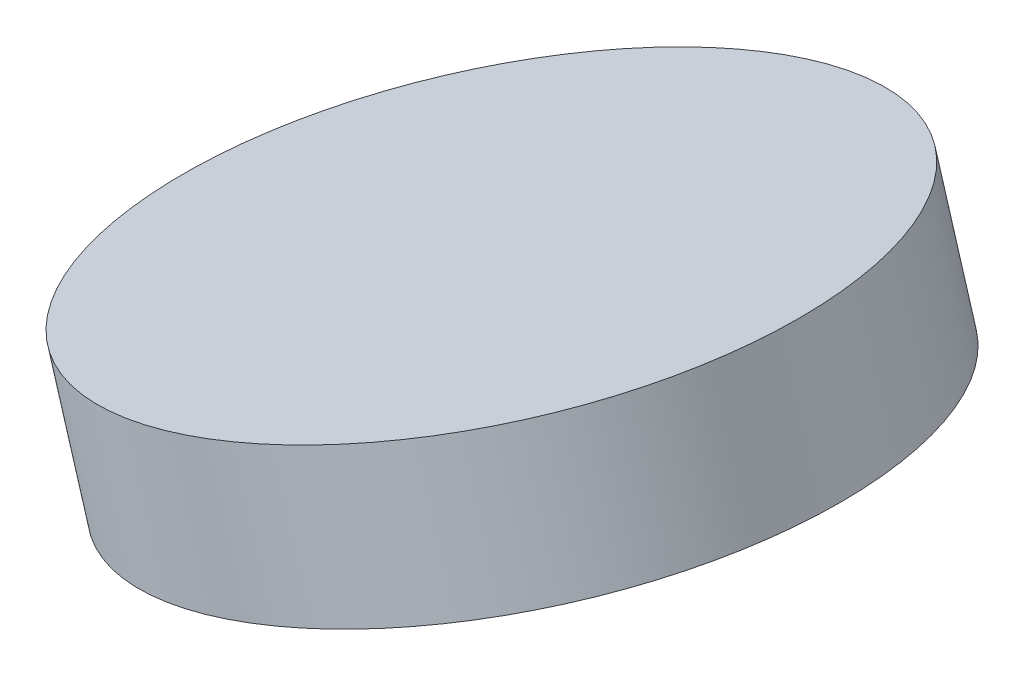
ISO-10303-21;
HEADER;
FILE_DESCRIPTION(('STEP AP214'),'2;1');
FILE_NAME('part.step','',(''),(''),'','','');
FILE_SCHEMA(('AUTOMOTIVE_DESIGN { 1 0 10303 214 1 1 1 1 }'));
ENDSEC;
DATA;
#1=APPLICATION_CONTEXT('core data for automotive mechanical design processes');
#2=APPLICATION_PROTOCOL_DEFINITION('international standard','automotive_design',2000,#1);
#3=PRODUCT_CONTEXT('',#1,'mechanical');
#4=PRODUCT('Part','Part','',(#3));
#5=PRODUCT_RELATED_PRODUCT_CATEGORY('part','',(#4));
#6=PRODUCT_DEFINITION_FORMATION('','',#4);
#7=PRODUCT_DEFINITION_CONTEXT('part definition',#1,'design');
#8=PRODUCT_DEFINITION('design','',#6,#7);
#9=PRODUCT_DEFINITION_SHAPE('','',#8);
#10=(LENGTH_UNIT() NAMED_UNIT(*) SI_UNIT(.MILLI.,.METRE.));
#11=(NAMED_UNIT(*) PLANE_ANGLE_UNIT() SI_UNIT($,.RADIAN.));
#12=(NAMED_UNIT(*) SI_UNIT($,.STERADIAN.) SOLID_ANGLE_UNIT());
#13=UNCERTAINTY_MEASURE_WITH_UNIT(LENGTH_MEASURE(1.E-05),#10,'distance_accuracy_value','');
#14=(GEOMETRIC_REPRESENTATION_CONTEXT(3) GLOBAL_UNCERTAINTY_ASSIGNED_CONTEXT((#13)) GLOBAL_UNIT_ASSIGNED_CONTEXT((#10,
#11,#12)) REPRESENTATION_CONTEXT('',''));
#15=CARTESIAN_POINT('',(0.,0.,0.));
#16=DIRECTION('',(0.,0.,1.));
#17=DIRECTION('',(1.,0.,0.));
#18=AXIS2_PLACEMENT_3D('',#15,#16,#17);
#19=CARTESIAN_POINT('',(-2.85333923385209,9.58428167452148,0.));
#20=DIRECTION('',(-0.285333923385198,0.95842816745211,0.));
#21=DIRECTION('',(-0.95842816745211,-0.285333923385198,0.));
#22=AXIS2_PLACEMENT_3D('',#19,#20,#21);
#23=CYLINDRICAL_SURFACE('',#22,4.44037160607082);
#24=CARTESIAN_POINT('',(-2.85333923385209,9.58428167452148,0.));
#25=DIRECTION('',(0.285333923385198,-0.95842816745211,0.));
#26=DIRECTION('',(0.95842816745211,0.285333923385198,0.));
#27=AXIS2_PLACEMENT_3D('',#24,#25,#26);
#28=CIRCLE('',#27,4.44037160607082);
#29=CARTESIAN_POINT('',(1.40243798736075,10.8512703261699,0.));
#30=VERTEX_POINT('',#29);
#31=EDGE_CURVE('E10',#30,#30,#28,.T.);
#32=ORIENTED_EDGE('',*,*,#31,.F.);
#33=EDGE_LOOP('',(#32));
#34=FACE_BOUND('',#33,.T.);
#35=CARTESIAN_POINT('',(-3.42400708062248,11.5011380094257,0.));
#36=DIRECTION('',(0.285333923385198,-0.95842816745211,0.));
#37=DIRECTION('',(0.95842816745211,0.285333923385198,0.));
#38=AXIS2_PLACEMENT_3D('',#35,#36,#37);
#39=CIRCLE('',#38,4.44037160607082);
#40=CARTESIAN_POINT('',(0.831770140590357,12.7681266610741,0.));
#41=VERTEX_POINT('',#40);
#42=EDGE_CURVE('E34',#41,#41,#39,.T.);
#43=ORIENTED_EDGE('',*,*,#42,.T.);
#44=EDGE_LOOP('',(#43));
#45=FACE_BOUND('',#44,.T.);
#46=ADVANCED_FACE('F31',(#34,#45),#23,.T.);
#47=CARTESIAN_POINT('',(-2.85333923385209,9.58428167452148,0.));
#48=DIRECTION('',(0.285333923385198,-0.95842816745211,0.));
#49=DIRECTION('',(0.95842816745211,0.285333923385198,0.));
#50=AXIS2_PLACEMENT_3D('',#47,#48,#49);
#51=PLANE('',#50);
#52=ORIENTED_EDGE('',*,*,#31,.T.);
#53=EDGE_LOOP('',(#52));
#54=FACE_BOUND('',#53,.T.);
#55=ADVANCED_FACE('F46',(#54),#51,.T.);
#56=CARTESIAN_POINT('',(-3.42400708062248,11.5011380094257,0.));
#57=DIRECTION('',(0.285333923385198,-0.95842816745211,0.));
#58=DIRECTION('',(0.95842816745211,0.285333923385198,0.));
#59=AXIS2_PLACEMENT_3D('',#56,#57,#58);
#60=PLANE('',#59);
#61=ORIENTED_EDGE('',*,*,#42,.F.);
#62=EDGE_LOOP('',(#61));
#63=FACE_BOUND('',#62,.T.);
#64=ADVANCED_FACE('F44',(#63),#60,.F.);
#65=CLOSED_SHELL('',(#46,#55,#64));
#66=MANIFOLD_SOLID_BREP('B2',#65);
#67=ADVANCED_BREP_SHAPE_REPRESENTATION('',(#18,#66),#14);
#68=SHAPE_DEFINITION_REPRESENTATION(#9,#67);
ENDSEC;
END-ISO-10303-21;
